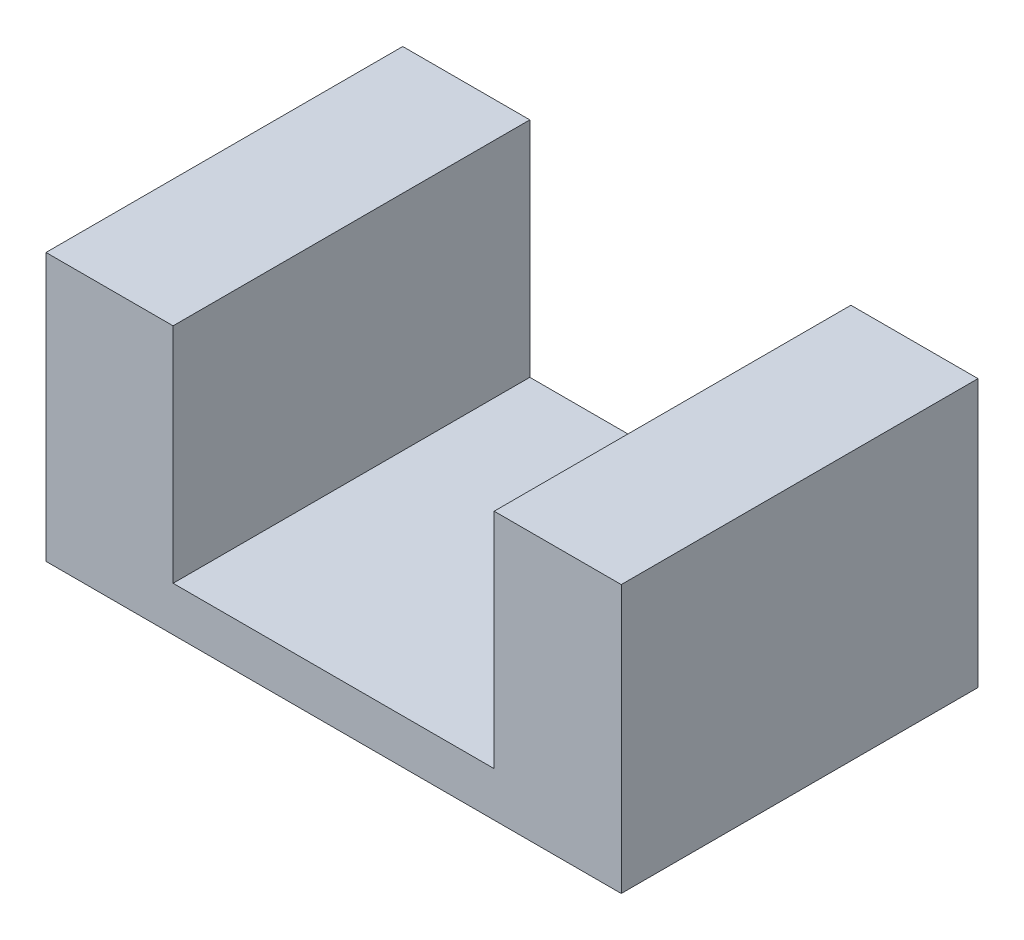
ISO-10303-21;
HEADER;
FILE_DESCRIPTION(('STEP AP214'),'2;1');
FILE_NAME('part.step','',(''),(''),'','','');
FILE_SCHEMA(('AUTOMOTIVE_DESIGN { 1 0 10303 214 1 1 1 1 }'));
ENDSEC;
DATA;
#1=APPLICATION_CONTEXT('core data for automotive mechanical design processes');
#2=APPLICATION_PROTOCOL_DEFINITION('international standard','automotive_design',2000,#1);
#3=PRODUCT_CONTEXT('',#1,'mechanical');
#4=PRODUCT('Part','Part','',(#3));
#5=PRODUCT_RELATED_PRODUCT_CATEGORY('part','',(#4));
#6=PRODUCT_DEFINITION_FORMATION('','',#4);
#7=PRODUCT_DEFINITION_CONTEXT('part definition',#1,'design');
#8=PRODUCT_DEFINITION('design','',#6,#7);
#9=PRODUCT_DEFINITION_SHAPE('','',#8);
#10=(LENGTH_UNIT() NAMED_UNIT(*) SI_UNIT(.MILLI.,.METRE.));
#11=(NAMED_UNIT(*) PLANE_ANGLE_UNIT() SI_UNIT($,.RADIAN.));
#12=(NAMED_UNIT(*) SI_UNIT($,.STERADIAN.) SOLID_ANGLE_UNIT());
#13=UNCERTAINTY_MEASURE_WITH_UNIT(LENGTH_MEASURE(1.E-05),#10,'distance_accuracy_value','');
#14=(GEOMETRIC_REPRESENTATION_CONTEXT(3) GLOBAL_UNCERTAINTY_ASSIGNED_CONTEXT((#13)) GLOBAL_UNIT_ASSIGNED_CONTEXT((#10,
#11,#12)) REPRESENTATION_CONTEXT('',''));
#15=CARTESIAN_POINT('',(0.,0.,0.));
#16=DIRECTION('',(0.,0.,1.));
#17=DIRECTION('',(1.,0.,0.));
#18=AXIS2_PLACEMENT_3D('',#15,#16,#17);
#19=CARTESIAN_POINT('',(-12.9,-15.,5.));
#20=DIRECTION('',(0.,1.,0.));
#21=DIRECTION('',(1.,0.,0.));
#22=AXIS2_PLACEMENT_3D('',#19,#20,#21);
#23=PLANE('',#22);
#24=DIRECTION('',(0.,0.,1.));
#25=VECTOR('',#24,1.);
#26=CARTESIAN_POINT('',(12.9,-15.,5.));
#27=LINE('',#26,#25);
#28=CARTESIAN_POINT('',(12.9,-15.,5.));
#29=VERTEX_POINT('',#28);
#30=CARTESIAN_POINT('',(12.9,-15.,21.));
#31=VERTEX_POINT('',#30);
#32=EDGE_CURVE('E109',#29,#31,#27,.T.);
#33=ORIENTED_EDGE('',*,*,#32,.T.);
#34=DIRECTION('',(-1.,0.,0.));
#35=VECTOR('',#34,1.);
#36=CARTESIAN_POINT('',(12.9,-15.,21.));
#37=LINE('',#36,#35);
#38=CARTESIAN_POINT('',(-12.9,-15.,21.));
#39=VERTEX_POINT('',#38);
#40=EDGE_CURVE('E154',#31,#39,#37,.T.);
#41=ORIENTED_EDGE('',*,*,#40,.T.);
#42=DIRECTION('',(0.,0.,1.));
#43=VECTOR('',#42,1.);
#44=CARTESIAN_POINT('',(-12.9,-15.,5.));
#45=LINE('',#44,#43);
#46=CARTESIAN_POINT('',(-12.9,-15.,5.));
#47=VERTEX_POINT('',#46);
#48=EDGE_CURVE('E158',#47,#39,#45,.T.);
#49=ORIENTED_EDGE('',*,*,#48,.F.);
#50=DIRECTION('',(1.,0.,0.));
#51=VECTOR('',#50,1.);
#52=CARTESIAN_POINT('',(-12.9,-15.,5.));
#53=LINE('',#52,#51);
#54=EDGE_CURVE('E9',#47,#29,#53,.T.);
#55=ORIENTED_EDGE('',*,*,#54,.T.);
#56=EDGE_LOOP('',(#33,#41,#49,#55));
#57=FACE_BOUND('',#56,.T.);
#58=ADVANCED_FACE('F15',(#57),#23,.F.);
#59=CARTESIAN_POINT('',(-12.9,-15.,5.));
#60=DIRECTION('',(0.,0.,1.));
#61=DIRECTION('',(1.,0.,0.));
#62=AXIS2_PLACEMENT_3D('',#59,#60,#61);
#63=PLANE('',#62);
#64=DIRECTION('',(1.,0.,0.));
#65=VECTOR('',#64,1.);
#66=CARTESIAN_POINT('',(-12.9,-3.,5.));
#67=LINE('',#66,#65);
#68=CARTESIAN_POINT('',(-12.9,-3.,5.));
#69=VERTEX_POINT('',#68);
#70=CARTESIAN_POINT('',(-7.2,-3.,5.));
#71=VERTEX_POINT('',#70);
#72=EDGE_CURVE('E24',#69,#71,#67,.T.);
#73=ORIENTED_EDGE('',*,*,#72,.T.);
#74=DIRECTION('',(0.,1.,0.));
#75=VECTOR('',#74,1.);
#76=CARTESIAN_POINT('',(-7.2,-15.,5.));
#77=LINE('',#76,#75);
#78=CARTESIAN_POINT('',(-7.2,-13.,5.));
#79=VERTEX_POINT('',#78);
#80=EDGE_CURVE('E96',#79,#71,#77,.T.);
#81=ORIENTED_EDGE('',*,*,#80,.F.);
#82=DIRECTION('',(1.,0.,0.));
#83=VECTOR('',#82,1.);
#84=CARTESIAN_POINT('',(-12.9,-13.,5.));
#85=LINE('',#84,#83);
#86=CARTESIAN_POINT('',(7.2,-13.,5.));
#87=VERTEX_POINT('',#86);
#88=EDGE_CURVE('E88',#79,#87,#85,.T.);
#89=ORIENTED_EDGE('',*,*,#88,.T.);
#90=DIRECTION('',(0.,1.,0.));
#91=VECTOR('',#90,1.);
#92=CARTESIAN_POINT('',(7.2,-15.,5.));
#93=LINE('',#92,#91);
#94=CARTESIAN_POINT('',(7.2,-3.,5.));
#95=VERTEX_POINT('',#94);
#96=EDGE_CURVE('E69',#87,#95,#93,.T.);
#97=ORIENTED_EDGE('',*,*,#96,.T.);
#98=DIRECTION('',(1.,0.,0.));
#99=VECTOR('',#98,1.);
#100=CARTESIAN_POINT('',(7.2,-3.,5.));
#101=LINE('',#100,#99);
#102=CARTESIAN_POINT('',(12.9,-3.,5.));
#103=VERTEX_POINT('',#102);
#104=EDGE_CURVE('E82',#95,#103,#101,.T.);
#105=ORIENTED_EDGE('',*,*,#104,.T.);
#106=DIRECTION('',(0.,-1.,0.));
#107=VECTOR('',#106,1.);
#108=CARTESIAN_POINT('',(12.9,-3.,5.));
#109=LINE('',#108,#107);
#110=EDGE_CURVE('E46',#103,#29,#109,.T.);
#111=ORIENTED_EDGE('',*,*,#110,.T.);
#112=ORIENTED_EDGE('',*,*,#54,.F.);
#113=DIRECTION('',(0.,-1.,0.));
#114=VECTOR('',#113,1.);
#115=CARTESIAN_POINT('',(-12.9,-3.,5.));
#116=LINE('',#115,#114);
#117=EDGE_CURVE('E122',#69,#47,#116,.T.);
#118=ORIENTED_EDGE('',*,*,#117,.F.);
#119=EDGE_LOOP('',(#73,#81,#89,#97,#105,#111,#112,#118));
#120=FACE_BOUND('',#119,.T.);
#121=ADVANCED_FACE('F17',(#120),#63,.F.);
#122=CARTESIAN_POINT('',(-12.9,-3.,5.));
#123=DIRECTION('',(0.,1.,0.));
#124=DIRECTION('',(1.,0.,0.));
#125=AXIS2_PLACEMENT_3D('',#122,#123,#124);
#126=PLANE('',#125);
#127=ORIENTED_EDGE('',*,*,#72,.F.);
#128=DIRECTION('',(0.,0.,1.));
#129=VECTOR('',#128,1.);
#130=CARTESIAN_POINT('',(-12.9,-3.,5.));
#131=LINE('',#130,#129);
#132=CARTESIAN_POINT('',(-12.9,-3.,21.));
#133=VERTEX_POINT('',#132);
#134=EDGE_CURVE('E164',#69,#133,#131,.T.);
#135=ORIENTED_EDGE('',*,*,#134,.T.);
#136=DIRECTION('',(1.,0.,0.));
#137=VECTOR('',#136,1.);
#138=CARTESIAN_POINT('',(-12.9,-3.,21.));
#139=LINE('',#138,#137);
#140=CARTESIAN_POINT('',(-7.2,-3.,21.));
#141=VERTEX_POINT('',#140);
#142=EDGE_CURVE('E129',#133,#141,#139,.T.);
#143=ORIENTED_EDGE('',*,*,#142,.T.);
#144=DIRECTION('',(0.,0.,1.));
#145=VECTOR('',#144,1.);
#146=CARTESIAN_POINT('',(-7.2,-3.,5.));
#147=LINE('',#146,#145);
#148=EDGE_CURVE('E99',#71,#141,#147,.T.);
#149=ORIENTED_EDGE('',*,*,#148,.F.);
#150=EDGE_LOOP('',(#127,#135,#143,#149));
#151=FACE_BOUND('',#150,.T.);
#152=ADVANCED_FACE('F127',(#151),#126,.T.);
#153=CARTESIAN_POINT('',(12.9,-15.,5.));
#154=DIRECTION('',(1.,0.,0.));
#155=DIRECTION('',(0.,1.,0.));
#156=AXIS2_PLACEMENT_3D('',#153,#154,#155);
#157=PLANE('',#156);
#158=ORIENTED_EDGE('',*,*,#32,.F.);
#159=ORIENTED_EDGE('',*,*,#110,.F.);
#160=DIRECTION('',(0.,0.,1.));
#161=VECTOR('',#160,1.);
#162=CARTESIAN_POINT('',(12.9,-3.,5.));
#163=LINE('',#162,#161);
#164=CARTESIAN_POINT('',(12.9,-3.,21.));
#165=VERTEX_POINT('',#164);
#166=EDGE_CURVE('E113',#103,#165,#163,.T.);
#167=ORIENTED_EDGE('',*,*,#166,.T.);
#168=DIRECTION('',(0.,1.,0.));
#169=VECTOR('',#168,1.);
#170=CARTESIAN_POINT('',(12.9,-15.,21.));
#171=LINE('',#170,#169);
#172=EDGE_CURVE('E150',#31,#165,#171,.T.);
#173=ORIENTED_EDGE('',*,*,#172,.F.);
#174=EDGE_LOOP('',(#158,#159,#167,#173));
#175=FACE_BOUND('',#174,.T.);
#176=ADVANCED_FACE('F207',(#175),#157,.T.);
#177=CARTESIAN_POINT('',(7.2,-3.,5.));
#178=DIRECTION('',(0.,1.,0.));
#179=DIRECTION('',(1.,0.,0.));
#180=AXIS2_PLACEMENT_3D('',#177,#178,#179);
#181=PLANE('',#180);
#182=ORIENTED_EDGE('',*,*,#104,.F.);
#183=DIRECTION('',(0.,0.,1.));
#184=VECTOR('',#183,1.);
#185=CARTESIAN_POINT('',(7.2,-3.,5.));
#186=LINE('',#185,#184);
#187=CARTESIAN_POINT('',(7.2,-3.,21.));
#188=VERTEX_POINT('',#187);
#189=EDGE_CURVE('E77',#95,#188,#186,.T.);
#190=ORIENTED_EDGE('',*,*,#189,.T.);
#191=DIRECTION('',(1.,0.,0.));
#192=VECTOR('',#191,1.);
#193=CARTESIAN_POINT('',(7.2,-3.,21.));
#194=LINE('',#193,#192);
#195=EDGE_CURVE('E146',#188,#165,#194,.T.);
#196=ORIENTED_EDGE('',*,*,#195,.T.);
#197=ORIENTED_EDGE('',*,*,#166,.F.);
#198=EDGE_LOOP('',(#182,#190,#196,#197));
#199=FACE_BOUND('',#198,.T.);
#200=ADVANCED_FACE('F211',(#199),#181,.T.);
#201=CARTESIAN_POINT('',(7.2,-15.,5.));
#202=DIRECTION('',(1.,0.,0.));
#203=DIRECTION('',(0.,1.,0.));
#204=AXIS2_PLACEMENT_3D('',#201,#202,#203);
#205=PLANE('',#204);
#206=ORIENTED_EDGE('',*,*,#189,.F.);
#207=ORIENTED_EDGE('',*,*,#96,.F.);
#208=DIRECTION('',(0.,0.,-1.));
#209=VECTOR('',#208,1.);
#210=CARTESIAN_POINT('',(7.2,-13.,5.));
#211=LINE('',#210,#209);
#212=CARTESIAN_POINT('',(7.2,-13.,21.));
#213=VERTEX_POINT('',#212);
#214=EDGE_CURVE('E74',#213,#87,#211,.T.);
#215=ORIENTED_EDGE('',*,*,#214,.F.);
#216=DIRECTION('',(0.,1.,0.));
#217=VECTOR('',#216,1.);
#218=CARTESIAN_POINT('',(7.2,-15.,21.));
#219=LINE('',#218,#217);
#220=EDGE_CURVE('E143',#213,#188,#219,.T.);
#221=ORIENTED_EDGE('',*,*,#220,.T.);
#222=EDGE_LOOP('',(#206,#207,#215,#221));
#223=FACE_BOUND('',#222,.T.);
#224=ADVANCED_FACE('F71',(#223),#205,.F.);
#225=CARTESIAN_POINT('',(-12.9,-13.,5.));
#226=DIRECTION('',(0.,1.,0.));
#227=DIRECTION('',(1.,0.,0.));
#228=AXIS2_PLACEMENT_3D('',#225,#226,#227);
#229=PLANE('',#228);
#230=ORIENTED_EDGE('',*,*,#88,.F.);
#231=DIRECTION('',(0.,0.,-1.));
#232=VECTOR('',#231,1.);
#233=CARTESIAN_POINT('',(-7.2,-13.,5.));
#234=LINE('',#233,#232);
#235=CARTESIAN_POINT('',(-7.2,-13.,21.));
#236=VERTEX_POINT('',#235);
#237=EDGE_CURVE('E134',#236,#79,#234,.T.);
#238=ORIENTED_EDGE('',*,*,#237,.F.);
#239=DIRECTION('',(1.,0.,0.));
#240=VECTOR('',#239,1.);
#241=CARTESIAN_POINT('',(-12.9,-13.,21.));
#242=LINE('',#241,#240);
#243=EDGE_CURVE('E91',#236,#213,#242,.T.);
#244=ORIENTED_EDGE('',*,*,#243,.T.);
#245=ORIENTED_EDGE('',*,*,#214,.T.);
#246=EDGE_LOOP('',(#230,#238,#244,#245));
#247=FACE_BOUND('',#246,.T.);
#248=ADVANCED_FACE('F86',(#247),#229,.T.);
#249=CARTESIAN_POINT('',(-7.2,-15.,5.));
#250=DIRECTION('',(1.,0.,0.));
#251=DIRECTION('',(0.,1.,0.));
#252=AXIS2_PLACEMENT_3D('',#249,#250,#251);
#253=PLANE('',#252);
#254=DIRECTION('',(0.,1.,0.));
#255=VECTOR('',#254,1.);
#256=CARTESIAN_POINT('',(-7.2,-15.,21.));
#257=LINE('',#256,#255);
#258=EDGE_CURVE('E142',#236,#141,#257,.T.);
#259=ORIENTED_EDGE('',*,*,#258,.F.);
#260=ORIENTED_EDGE('',*,*,#237,.T.);
#261=ORIENTED_EDGE('',*,*,#80,.T.);
#262=ORIENTED_EDGE('',*,*,#148,.T.);
#263=EDGE_LOOP('',(#259,#260,#261,#262));
#264=FACE_BOUND('',#263,.T.);
#265=ADVANCED_FACE('F133',(#264),#253,.T.);
#266=CARTESIAN_POINT('',(-12.9,-15.,21.));
#267=DIRECTION('',(0.,0.,1.));
#268=DIRECTION('',(1.,0.,0.));
#269=AXIS2_PLACEMENT_3D('',#266,#267,#268);
#270=PLANE('',#269);
#271=DIRECTION('',(0.,1.,0.));
#272=VECTOR('',#271,1.);
#273=CARTESIAN_POINT('',(-12.9,-15.,21.));
#274=LINE('',#273,#272);
#275=EDGE_CURVE('E167',#39,#133,#274,.T.);
#276=ORIENTED_EDGE('',*,*,#275,.F.);
#277=ORIENTED_EDGE('',*,*,#40,.F.);
#278=ORIENTED_EDGE('',*,*,#172,.T.);
#279=ORIENTED_EDGE('',*,*,#195,.F.);
#280=ORIENTED_EDGE('',*,*,#220,.F.);
#281=ORIENTED_EDGE('',*,*,#243,.F.);
#282=ORIENTED_EDGE('',*,*,#258,.T.);
#283=ORIENTED_EDGE('',*,*,#142,.F.);
#284=EDGE_LOOP('',(#276,#277,#278,#279,#280,#281,#282,#283));
#285=FACE_BOUND('',#284,.T.);
#286=ADVANCED_FACE('F179',(#285),#270,.T.);
#287=CARTESIAN_POINT('',(-12.9,-15.,5.));
#288=DIRECTION('',(1.,0.,0.));
#289=DIRECTION('',(0.,1.,0.));
#290=AXIS2_PLACEMENT_3D('',#287,#288,#289);
#291=PLANE('',#290);
#292=ORIENTED_EDGE('',*,*,#275,.T.);
#293=ORIENTED_EDGE('',*,*,#134,.F.);
#294=ORIENTED_EDGE('',*,*,#117,.T.);
#295=ORIENTED_EDGE('',*,*,#48,.T.);
#296=EDGE_LOOP('',(#292,#293,#294,#295));
#297=FACE_BOUND('',#296,.T.);
#298=ADVANCED_FACE('F213',(#297),#291,.F.);
#299=CLOSED_SHELL('',(#58,#121,#152,#176,#200,#224,#248,#265,#286,#298));
#300=MANIFOLD_SOLID_BREP('B1',#299);
#301=ADVANCED_BREP_SHAPE_REPRESENTATION('',(#18,#300),#14);
#302=SHAPE_DEFINITION_REPRESENTATION(#9,#301);
ENDSEC;
END-ISO-10303-21;
